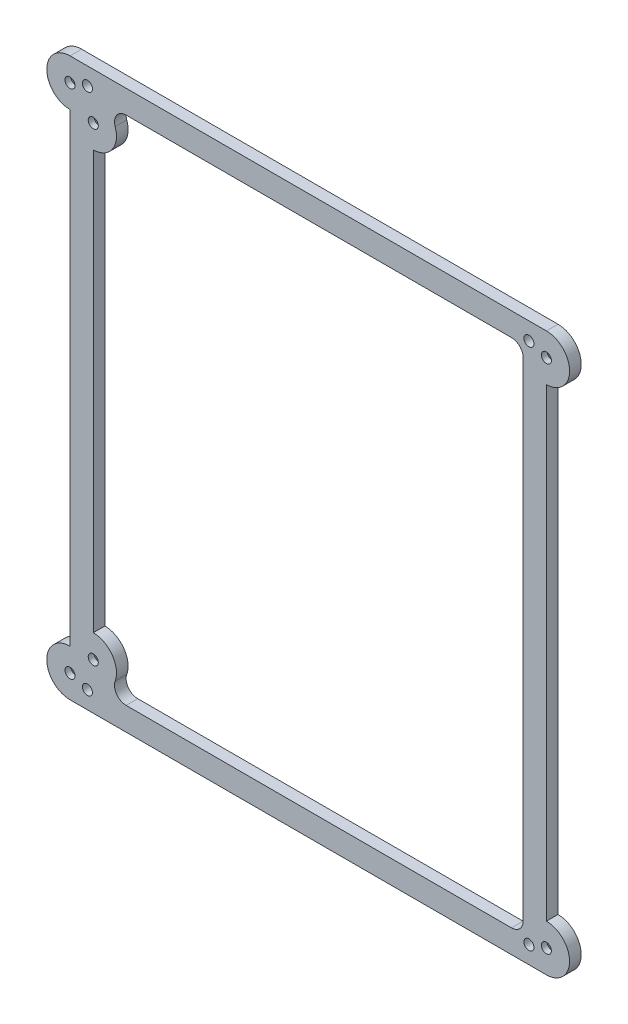
ISO-10303-21;
HEADER;
FILE_DESCRIPTION(('STEP AP214'),'2;1');
FILE_NAME('part.step','',(''),(''),'','','');
FILE_SCHEMA(('AUTOMOTIVE_DESIGN { 1 0 10303 214 1 1 1 1 }'));
ENDSEC;
DATA;
#1=APPLICATION_CONTEXT('core data for automotive mechanical design processes');
#2=APPLICATION_PROTOCOL_DEFINITION('international standard','automotive_design',2000,#1);
#3=PRODUCT_CONTEXT('',#1,'mechanical');
#4=PRODUCT('Part','Part','',(#3));
#5=PRODUCT_RELATED_PRODUCT_CATEGORY('part','',(#4));
#6=PRODUCT_DEFINITION_FORMATION('','',#4);
#7=PRODUCT_DEFINITION_CONTEXT('part definition',#1,'design');
#8=PRODUCT_DEFINITION('design','',#6,#7);
#9=PRODUCT_DEFINITION_SHAPE('','',#8);
#10=(LENGTH_UNIT() NAMED_UNIT(*) SI_UNIT(.MILLI.,.METRE.));
#11=(NAMED_UNIT(*) PLANE_ANGLE_UNIT() SI_UNIT($,.RADIAN.));
#12=(NAMED_UNIT(*) SI_UNIT($,.STERADIAN.) SOLID_ANGLE_UNIT());
#13=UNCERTAINTY_MEASURE_WITH_UNIT(LENGTH_MEASURE(1.E-05),#10,'distance_accuracy_value','');
#14=(GEOMETRIC_REPRESENTATION_CONTEXT(3) GLOBAL_UNCERTAINTY_ASSIGNED_CONTEXT((#13)) GLOBAL_UNIT_ASSIGNED_CONTEXT((#10,
#11,#12)) REPRESENTATION_CONTEXT('',''));
#15=CARTESIAN_POINT('',(0.,0.,0.));
#16=DIRECTION('',(0.,0.,1.));
#17=DIRECTION('',(1.,0.,0.));
#18=AXIS2_PLACEMENT_3D('',#15,#16,#17);
#19=CARTESIAN_POINT('',(-19.050000000002,6.35000000000164,6.35));
#20=DIRECTION('',(0.,0.,-1.));
#21=DIRECTION('',(-1.,0.,0.));
#22=AXIS2_PLACEMENT_3D('',#19,#20,#21);
#23=CYLINDRICAL_SURFACE('',#22,12.7);
#24=CARTESIAN_POINT('',(-19.050000000002,6.35000000000164,0.));
#25=DIRECTION('',(0.,0.,1.));
#26=DIRECTION('',(1.,0.,0.));
#27=AXIS2_PLACEMENT_3D('',#24,#25,#26);
#28=CIRCLE('',#27,12.7);
#29=CARTESIAN_POINT('',(-19.050000000002,19.0500000000016,0.));
#30=VERTEX_POINT('',#29);
#31=CARTESIAN_POINT('',(-19.050000000002,-6.34999999999836,0.));
#32=VERTEX_POINT('',#31);
#33=EDGE_CURVE('E272',#30,#32,#28,.T.);
#34=ORIENTED_EDGE('',*,*,#33,.T.);
#35=DIRECTION('',(0.,0.,-1.));
#36=VECTOR('',#35,1.);
#37=CARTESIAN_POINT('',(-19.050000000002,-6.34999999999836,6.35));
#38=LINE('',#37,#36);
#39=CARTESIAN_POINT('',(-19.050000000002,-6.34999999999836,6.35));
#40=VERTEX_POINT('',#39);
#41=EDGE_CURVE('E320',#40,#32,#38,.T.);
#42=ORIENTED_EDGE('',*,*,#41,.F.);
#43=CARTESIAN_POINT('',(-19.050000000002,6.35000000000164,6.35));
#44=DIRECTION('',(0.,0.,1.));
#45=DIRECTION('',(1.,0.,0.));
#46=AXIS2_PLACEMENT_3D('',#43,#44,#45);
#47=CIRCLE('',#46,12.7);
#48=CARTESIAN_POINT('',(-19.050000000002,19.0500000000016,6.35));
#49=VERTEX_POINT('',#48);
#50=EDGE_CURVE('E214',#49,#40,#47,.T.);
#51=ORIENTED_EDGE('',*,*,#50,.F.);
#52=DIRECTION('',(0.,0.,-1.));
#53=VECTOR('',#52,1.);
#54=CARTESIAN_POINT('',(-19.050000000002,19.0500000000016,6.35));
#55=LINE('',#54,#53);
#56=EDGE_CURVE('E182',#49,#30,#55,.T.);
#57=ORIENTED_EDGE('',*,*,#56,.T.);
#58=EDGE_LOOP('',(#34,#42,#51,#57));
#59=FACE_BOUND('',#58,.T.);
#60=ADVANCED_FACE('F43',(#59),#23,.T.);
#61=CARTESIAN_POINT('',(-19.050000000002,0.,6.35));
#62=DIRECTION('',(-1.,0.,0.));
#63=DIRECTION('',(0.,0.,1.));
#64=AXIS2_PLACEMENT_3D('',#61,#62,#63);
#65=PLANE('',#64);
#66=DIRECTION('',(0.,1.,0.));
#67=VECTOR('',#66,1.);
#68=CARTESIAN_POINT('',(-19.050000000002,0.,0.));
#69=LINE('',#68,#67);
#70=CARTESIAN_POINT('',(-19.050000000002,-260.35,0.));
#71=VERTEX_POINT('',#70);
#72=EDGE_CURVE('E275',#71,#32,#69,.T.);
#73=ORIENTED_EDGE('',*,*,#72,.F.);
#74=DIRECTION('',(0.,0.,-1.));
#75=VECTOR('',#74,1.);
#76=CARTESIAN_POINT('',(-19.050000000002,-260.35,6.35));
#77=LINE('',#76,#75);
#78=CARTESIAN_POINT('',(-19.050000000002,-260.35,6.35));
#79=VERTEX_POINT('',#78);
#80=EDGE_CURVE('E318',#79,#71,#77,.T.);
#81=ORIENTED_EDGE('',*,*,#80,.F.);
#82=DIRECTION('',(0.,1.,0.));
#83=VECTOR('',#82,1.);
#84=CARTESIAN_POINT('',(-19.050000000002,0.,6.35));
#85=LINE('',#84,#83);
#86=EDGE_CURVE('E216',#79,#40,#85,.T.);
#87=ORIENTED_EDGE('',*,*,#86,.T.);
#88=ORIENTED_EDGE('',*,*,#41,.T.);
#89=EDGE_LOOP('',(#73,#81,#87,#88));
#90=FACE_BOUND('',#89,.T.);
#91=ADVANCED_FACE('F436',(#90),#65,.T.);
#92=CARTESIAN_POINT('',(-19.050000000002,-273.05,6.35));
#93=DIRECTION('',(0.,0.,-1.));
#94=DIRECTION('',(-1.,0.,0.));
#95=AXIS2_PLACEMENT_3D('',#92,#93,#94);
#96=CYLINDRICAL_SURFACE('',#95,12.7);
#97=CARTESIAN_POINT('',(-19.050000000002,-273.05,0.));
#98=DIRECTION('',(0.,0.,1.));
#99=DIRECTION('',(1.,0.,0.));
#100=AXIS2_PLACEMENT_3D('',#97,#98,#99);
#101=CIRCLE('',#100,12.7);
#102=CARTESIAN_POINT('',(-19.050000000002,-285.75,0.));
#103=VERTEX_POINT('',#102);
#104=EDGE_CURVE('E278',#103,#71,#101,.F.);
#105=ORIENTED_EDGE('',*,*,#104,.F.);
#106=DIRECTION('',(0.,0.,-1.));
#107=VECTOR('',#106,1.);
#108=CARTESIAN_POINT('',(-19.050000000002,-285.75,6.35));
#109=LINE('',#108,#107);
#110=CARTESIAN_POINT('',(-19.050000000002,-285.75,6.35));
#111=VERTEX_POINT('',#110);
#112=EDGE_CURVE('E316',#111,#103,#109,.T.);
#113=ORIENTED_EDGE('',*,*,#112,.F.);
#114=CARTESIAN_POINT('',(-19.050000000002,-273.05,6.35));
#115=DIRECTION('',(0.,0.,1.));
#116=DIRECTION('',(1.,0.,0.));
#117=AXIS2_PLACEMENT_3D('',#114,#115,#116);
#118=CIRCLE('',#117,12.7);
#119=EDGE_CURVE('E219',#111,#79,#118,.F.);
#120=ORIENTED_EDGE('',*,*,#119,.T.);
#121=ORIENTED_EDGE('',*,*,#80,.T.);
#122=EDGE_LOOP('',(#105,#113,#120,#121));
#123=FACE_BOUND('',#122,.T.);
#124=ADVANCED_FACE('F442',(#123),#96,.T.);
#125=CARTESIAN_POINT('',(0.,-285.75,6.35));
#126=DIRECTION('',(0.,1.,0.));
#127=DIRECTION('',(0.,0.,1.));
#128=AXIS2_PLACEMENT_3D('',#125,#126,#127);
#129=PLANE('',#128);
#130=DIRECTION('',(1.,0.,0.));
#131=VECTOR('',#130,1.);
#132=CARTESIAN_POINT('',(0.,-285.75,0.));
#133=LINE('',#132,#131);
#134=CARTESIAN_POINT('',(241.3,-285.75,0.));
#135=VERTEX_POINT('',#134);
#136=EDGE_CURVE('E281',#103,#135,#133,.T.);
#137=ORIENTED_EDGE('',*,*,#136,.T.);
#138=DIRECTION('',(0.,0.,-1.));
#139=VECTOR('',#138,1.);
#140=CARTESIAN_POINT('',(241.3,-285.75,6.35));
#141=LINE('',#140,#139);
#142=CARTESIAN_POINT('',(241.3,-285.75,6.35));
#143=VERTEX_POINT('',#142);
#144=EDGE_CURVE('E314',#143,#135,#141,.T.);
#145=ORIENTED_EDGE('',*,*,#144,.F.);
#146=DIRECTION('',(1.,0.,0.));
#147=VECTOR('',#146,1.);
#148=CARTESIAN_POINT('',(0.,-285.75,6.35));
#149=LINE('',#148,#147);
#150=EDGE_CURVE('E222',#111,#143,#149,.T.);
#151=ORIENTED_EDGE('',*,*,#150,.F.);
#152=ORIENTED_EDGE('',*,*,#112,.T.);
#153=EDGE_LOOP('',(#137,#145,#151,#152));
#154=FACE_BOUND('',#153,.T.);
#155=ADVANCED_FACE('F578',(#154),#129,.F.);
#156=CARTESIAN_POINT('',(241.3,-273.05,6.35));
#157=DIRECTION('',(0.,0.,-1.));
#158=DIRECTION('',(-1.,0.,0.));
#159=AXIS2_PLACEMENT_3D('',#156,#157,#158);
#160=CYLINDRICAL_SURFACE('',#159,12.7);
#161=CARTESIAN_POINT('',(241.3,-273.05,0.));
#162=DIRECTION('',(0.,0.,1.));
#163=DIRECTION('',(1.,0.,0.));
#164=AXIS2_PLACEMENT_3D('',#161,#162,#163);
#165=CIRCLE('',#164,12.7);
#166=CARTESIAN_POINT('',(241.3,-260.35,0.));
#167=VERTEX_POINT('',#166);
#168=EDGE_CURVE('E284',#167,#135,#165,.F.);
#169=ORIENTED_EDGE('',*,*,#168,.F.);
#170=DIRECTION('',(0.,0.,-1.));
#171=VECTOR('',#170,1.);
#172=CARTESIAN_POINT('',(241.3,-260.35,6.35));
#173=LINE('',#172,#171);
#174=CARTESIAN_POINT('',(241.3,-260.35,6.35));
#175=VERTEX_POINT('',#174);
#176=EDGE_CURVE('E312',#175,#167,#173,.T.);
#177=ORIENTED_EDGE('',*,*,#176,.F.);
#178=CARTESIAN_POINT('',(241.3,-273.05,6.35));
#179=DIRECTION('',(0.,0.,1.));
#180=DIRECTION('',(1.,0.,0.));
#181=AXIS2_PLACEMENT_3D('',#178,#179,#180);
#182=CIRCLE('',#181,12.7);
#183=EDGE_CURVE('E224',#175,#143,#182,.F.);
#184=ORIENTED_EDGE('',*,*,#183,.T.);
#185=ORIENTED_EDGE('',*,*,#144,.T.);
#186=EDGE_LOOP('',(#169,#177,#184,#185));
#187=FACE_BOUND('',#186,.T.);
#188=ADVANCED_FACE('F574',(#187),#160,.T.);
#189=CARTESIAN_POINT('',(241.3,0.,6.35));
#190=DIRECTION('',(-1.,0.,0.));
#191=DIRECTION('',(0.,0.,1.));
#192=AXIS2_PLACEMENT_3D('',#189,#190,#191);
#193=PLANE('',#192);
#194=DIRECTION('',(0.,1.,0.));
#195=VECTOR('',#194,1.);
#196=CARTESIAN_POINT('',(241.3,0.,0.));
#197=LINE('',#196,#195);
#198=CARTESIAN_POINT('',(241.3,-6.34999999999845,0.));
#199=VERTEX_POINT('',#198);
#200=EDGE_CURVE('E287',#167,#199,#197,.T.);
#201=ORIENTED_EDGE('',*,*,#200,.T.);
#202=DIRECTION('',(0.,0.,-1.));
#203=VECTOR('',#202,1.);
#204=CARTESIAN_POINT('',(241.3,-6.34999999999845,6.35));
#205=LINE('',#204,#203);
#206=CARTESIAN_POINT('',(241.3,-6.34999999999845,6.35));
#207=VERTEX_POINT('',#206);
#208=EDGE_CURVE('E310',#207,#199,#205,.T.);
#209=ORIENTED_EDGE('',*,*,#208,.F.);
#210=DIRECTION('',(0.,1.,0.));
#211=VECTOR('',#210,1.);
#212=CARTESIAN_POINT('',(241.3,0.,6.35));
#213=LINE('',#212,#211);
#214=EDGE_CURVE('E227',#175,#207,#213,.T.);
#215=ORIENTED_EDGE('',*,*,#214,.F.);
#216=ORIENTED_EDGE('',*,*,#176,.T.);
#217=EDGE_LOOP('',(#201,#209,#215,#216));
#218=FACE_BOUND('',#217,.T.);
#219=ADVANCED_FACE('F570',(#218),#193,.F.);
#220=CARTESIAN_POINT('',(241.3,6.3500000000016,6.35));
#221=DIRECTION('',(0.,0.,-1.));
#222=DIRECTION('',(-1.,0.,0.));
#223=AXIS2_PLACEMENT_3D('',#220,#221,#222);
#224=CYLINDRICAL_SURFACE('',#223,12.7000000000001);
#225=CARTESIAN_POINT('',(241.3,6.3500000000016,0.));
#226=DIRECTION('',(0.,0.,1.));
#227=DIRECTION('',(1.,0.,0.));
#228=AXIS2_PLACEMENT_3D('',#225,#226,#227);
#229=CIRCLE('',#228,12.7000000000001);
#230=CARTESIAN_POINT('',(241.3,19.0500000000016,0.));
#231=VERTEX_POINT('',#230);
#232=EDGE_CURVE('E290',#231,#199,#229,.F.);
#233=ORIENTED_EDGE('',*,*,#232,.F.);
#234=DIRECTION('',(0.,0.,-1.));
#235=VECTOR('',#234,1.);
#236=CARTESIAN_POINT('',(241.3,19.0500000000016,6.35));
#237=LINE('',#236,#235);
#238=CARTESIAN_POINT('',(241.3,19.0500000000016,6.35));
#239=VERTEX_POINT('',#238);
#240=EDGE_CURVE('E308',#239,#231,#237,.T.);
#241=ORIENTED_EDGE('',*,*,#240,.F.);
#242=CARTESIAN_POINT('',(241.3,6.3500000000016,6.35));
#243=DIRECTION('',(0.,0.,1.));
#244=DIRECTION('',(1.,0.,0.));
#245=AXIS2_PLACEMENT_3D('',#242,#243,#244);
#246=CIRCLE('',#245,12.7000000000001);
#247=EDGE_CURVE('E229',#239,#207,#246,.F.);
#248=ORIENTED_EDGE('',*,*,#247,.T.);
#249=ORIENTED_EDGE('',*,*,#208,.T.);
#250=EDGE_LOOP('',(#233,#241,#248,#249));
#251=FACE_BOUND('',#250,.T.);
#252=ADVANCED_FACE('F469',(#251),#224,.T.);
#253=CARTESIAN_POINT('',(-6.35000000000197,0.,6.35));
#254=DIRECTION('',(1.,0.,0.));
#255=DIRECTION('',(0.,0.,-1.));
#256=AXIS2_PLACEMENT_3D('',#253,#254,#255);
#257=PLANE('',#256);
#258=DIRECTION('',(0.,-1.,0.));
#259=VECTOR('',#258,1.);
#260=CARTESIAN_POINT('',(-6.35000000000197,0.,0.));
#261=LINE('',#260,#259);
#262=CARTESIAN_POINT('',(-6.35000000000197,-19.0499999999984,0.));
#263=VERTEX_POINT('',#262);
#264=CARTESIAN_POINT('',(-6.35000000000197,-247.65,0.));
#265=VERTEX_POINT('',#264);
#266=EDGE_CURVE('E178',#263,#265,#261,.T.);
#267=ORIENTED_EDGE('',*,*,#266,.F.);
#268=DIRECTION('',(0.,0.,-1.));
#269=VECTOR('',#268,1.);
#270=CARTESIAN_POINT('',(-6.35000000000197,-19.0499999999984,6.35));
#271=LINE('',#270,#269);
#272=CARTESIAN_POINT('',(-6.35000000000197,-19.0499999999984,6.35));
#273=VERTEX_POINT('',#272);
#274=EDGE_CURVE('E171',#273,#263,#271,.T.);
#275=ORIENTED_EDGE('',*,*,#274,.F.);
#276=DIRECTION('',(0.,-1.,0.));
#277=VECTOR('',#276,1.);
#278=CARTESIAN_POINT('',(-6.35000000000197,0.,6.35));
#279=LINE('',#278,#277);
#280=CARTESIAN_POINT('',(-6.35000000000197,-247.65,6.35));
#281=VERTEX_POINT('',#280);
#282=EDGE_CURVE('E176',#273,#281,#279,.T.);
#283=ORIENTED_EDGE('',*,*,#282,.T.);
#284=DIRECTION('',(0.,0.,-1.));
#285=VECTOR('',#284,1.);
#286=CARTESIAN_POINT('',(-6.35000000000197,-247.65,6.35));
#287=LINE('',#286,#285);
#288=EDGE_CURVE('E183',#281,#265,#287,.T.);
#289=ORIENTED_EDGE('',*,*,#288,.T.);
#290=EDGE_LOOP('',(#267,#275,#283,#289));
#291=FACE_BOUND('',#290,.T.);
#292=ADVANCED_FACE('F173',(#291),#257,.T.);
#293=CARTESIAN_POINT('',(-6.35000000000197,-6.34999999999836,6.35));
#294=DIRECTION('',(0.,0.,-1.));
#295=DIRECTION('',(-1.,0.,0.));
#296=AXIS2_PLACEMENT_3D('',#293,#294,#295);
#297=CYLINDRICAL_SURFACE('',#296,12.7);
#298=CARTESIAN_POINT('',(-6.35000000000197,-6.34999999999836,0.));
#299=DIRECTION('',(0.,0.,1.));
#300=DIRECTION('',(1.,0.,0.));
#301=AXIS2_PLACEMENT_3D('',#298,#299,#300);
#302=CIRCLE('',#301,12.7);
#303=CARTESIAN_POINT('',(5.62367482809024,-2.11666666666502,0.));
#304=VERTEX_POINT('',#303);
#305=EDGE_CURVE('E260',#263,#304,#302,.T.);
#306=ORIENTED_EDGE('',*,*,#305,.T.);
#307=DIRECTION('',(0.,0.,-1.));
#308=VECTOR('',#307,1.);
#309=CARTESIAN_POINT('',(5.62367482809024,-2.11666666666502,6.35));
#310=LINE('',#309,#308);
#311=CARTESIAN_POINT('',(5.62367482809024,-2.11666666666502,6.35));
#312=VERTEX_POINT('',#311);
#313=EDGE_CURVE('E189',#304,#312,#310,.F.);
#314=ORIENTED_EDGE('',*,*,#313,.T.);
#315=CARTESIAN_POINT('',(-6.35000000000197,-6.34999999999836,6.35));
#316=DIRECTION('',(0.,0.,1.));
#317=DIRECTION('',(1.,0.,0.));
#318=AXIS2_PLACEMENT_3D('',#315,#316,#317);
#319=CIRCLE('',#318,12.7);
#320=EDGE_CURVE('E186',#273,#312,#319,.T.);
#321=ORIENTED_EDGE('',*,*,#320,.F.);
#322=ORIENTED_EDGE('',*,*,#274,.T.);
#323=EDGE_LOOP('',(#306,#314,#321,#322));
#324=FACE_BOUND('',#323,.T.);
#325=ADVANCED_FACE('F187',(#324),#297,.T.);
#326=CARTESIAN_POINT('',(0.,6.35000000000165,6.35));
#327=DIRECTION('',(0.,1.,0.));
#328=DIRECTION('',(0.,0.,1.));
#329=AXIS2_PLACEMENT_3D('',#326,#327,#328);
#330=PLANE('',#329);
#331=DIRECTION('',(1.,0.,0.));
#332=VECTOR('',#331,1.);
#333=CARTESIAN_POINT('',(0.,6.35000000000165,6.35));
#334=LINE('',#333,#332);
#335=CARTESIAN_POINT('',(11.6105122421363,6.35000000000165,6.35));
#336=VERTEX_POINT('',#335);
#337=CARTESIAN_POINT('',(222.25,6.35000000000165,6.35));
#338=VERTEX_POINT('',#337);
#339=EDGE_CURVE('E191',#336,#338,#334,.T.);
#340=ORIENTED_EDGE('',*,*,#339,.F.);
#341=DIRECTION('',(0.,0.,1.));
#342=VECTOR('',#341,1.);
#343=CARTESIAN_POINT('',(11.6105122421363,6.35000000000165,0.));
#344=LINE('',#343,#342);
#345=CARTESIAN_POINT('',(11.6105122421363,6.35000000000165,0.));
#346=VERTEX_POINT('',#345);
#347=EDGE_CURVE('E333',#336,#346,#344,.F.);
#348=ORIENTED_EDGE('',*,*,#347,.T.);
#349=DIRECTION('',(1.,0.,0.));
#350=VECTOR('',#349,1.);
#351=CARTESIAN_POINT('',(0.,6.35000000000165,0.));
#352=LINE('',#351,#350);
#353=CARTESIAN_POINT('',(222.25,6.35000000000165,0.));
#354=VERTEX_POINT('',#353);
#355=EDGE_CURVE('E262',#346,#354,#352,.T.);
#356=ORIENTED_EDGE('',*,*,#355,.T.);
#357=DIRECTION('',(0.,0.,-1.));
#358=VECTOR('',#357,1.);
#359=CARTESIAN_POINT('',(222.25,6.35000000000165,6.35));
#360=LINE('',#359,#358);
#361=EDGE_CURVE('E331',#354,#338,#360,.F.);
#362=ORIENTED_EDGE('',*,*,#361,.T.);
#363=EDGE_LOOP('',(#340,#348,#356,#362));
#364=FACE_BOUND('',#363,.T.);
#365=ADVANCED_FACE('F463',(#364),#330,.F.);
#366=CARTESIAN_POINT('',(228.6,0.,6.35));
#367=DIRECTION('',(1.,0.,0.));
#368=DIRECTION('',(0.,0.,-1.));
#369=AXIS2_PLACEMENT_3D('',#366,#367,#368);
#370=PLANE('',#369);
#371=DIRECTION('',(0.,-1.,0.));
#372=VECTOR('',#371,1.);
#373=CARTESIAN_POINT('',(228.6,0.,6.35));
#374=LINE('',#373,#372);
#375=CARTESIAN_POINT('',(228.6,1.64972202565394E-12,6.35));
#376=VERTEX_POINT('',#375);
#377=CARTESIAN_POINT('',(228.6,-266.7,6.35));
#378=VERTEX_POINT('',#377);
#379=EDGE_CURVE('E205',#376,#378,#374,.T.);
#380=ORIENTED_EDGE('',*,*,#379,.F.);
#381=DIRECTION('',(0.,0.,-1.));
#382=VECTOR('',#381,1.);
#383=CARTESIAN_POINT('',(228.6,1.64972202565394E-12,0.));
#384=LINE('',#383,#382);
#385=CARTESIAN_POINT('',(228.6,1.64972202565394E-12,0.));
#386=VERTEX_POINT('',#385);
#387=EDGE_CURVE('E338',#376,#386,#384,.T.);
#388=ORIENTED_EDGE('',*,*,#387,.T.);
#389=DIRECTION('',(0.,-1.,0.));
#390=VECTOR('',#389,1.);
#391=CARTESIAN_POINT('',(228.6,0.,0.));
#392=LINE('',#391,#390);
#393=CARTESIAN_POINT('',(228.6,-266.7,0.));
#394=VERTEX_POINT('',#393);
#395=EDGE_CURVE('E265',#386,#394,#392,.T.);
#396=ORIENTED_EDGE('',*,*,#395,.T.);
#397=DIRECTION('',(0.,0.,-1.));
#398=VECTOR('',#397,1.);
#399=CARTESIAN_POINT('',(228.6,-266.7,6.35));
#400=LINE('',#399,#398);
#401=EDGE_CURVE('E59',#394,#378,#400,.F.);
#402=ORIENTED_EDGE('',*,*,#401,.T.);
#403=EDGE_LOOP('',(#380,#388,#396,#402));
#404=FACE_BOUND('',#403,.T.);
#405=ADVANCED_FACE('F459',(#404),#370,.F.);
#406=CARTESIAN_POINT('',(0.,-273.05,6.35));
#407=DIRECTION('',(0.,1.,0.));
#408=DIRECTION('',(-1.,0.,0.));
#409=AXIS2_PLACEMENT_3D('',#406,#407,#408);
#410=PLANE('',#409);
#411=DIRECTION('',(1.,0.,0.));
#412=VECTOR('',#411,1.);
#413=CARTESIAN_POINT('',(0.,-273.05,0.));
#414=LINE('',#413,#412);
#415=CARTESIAN_POINT('',(11.6105122421364,-273.05,0.));
#416=VERTEX_POINT('',#415);
#417=CARTESIAN_POINT('',(222.25,-273.05,0.));
#418=VERTEX_POINT('',#417);
#419=EDGE_CURVE('E267',#416,#418,#414,.T.);
#420=ORIENTED_EDGE('',*,*,#419,.F.);
#421=DIRECTION('',(0.,0.,-1.));
#422=VECTOR('',#421,1.);
#423=CARTESIAN_POINT('',(11.6105122421364,-273.05,6.35));
#424=LINE('',#423,#422);
#425=CARTESIAN_POINT('',(11.6105122421364,-273.05,6.35));
#426=VERTEX_POINT('',#425);
#427=EDGE_CURVE('E329',#416,#426,#424,.F.);
#428=ORIENTED_EDGE('',*,*,#427,.T.);
#429=DIRECTION('',(1.,0.,0.));
#430=VECTOR('',#429,1.);
#431=CARTESIAN_POINT('',(0.,-273.05,6.35));
#432=LINE('',#431,#430);
#433=CARTESIAN_POINT('',(222.25,-273.05,6.35));
#434=VERTEX_POINT('',#433);
#435=EDGE_CURVE('E207',#426,#434,#432,.T.);
#436=ORIENTED_EDGE('',*,*,#435,.T.);
#437=DIRECTION('',(0.,0.,-1.));
#438=VECTOR('',#437,1.);
#439=CARTESIAN_POINT('',(222.25,-273.05,6.35));
#440=LINE('',#439,#438);
#441=EDGE_CURVE('E326',#434,#418,#440,.T.);
#442=ORIENTED_EDGE('',*,*,#441,.T.);
#443=EDGE_LOOP('',(#420,#428,#436,#442));
#444=FACE_BOUND('',#443,.T.);
#445=ADVANCED_FACE('F455',(#444),#410,.T.);
#446=CARTESIAN_POINT('',(231.775,-276.225,6.35));
#447=DIRECTION('',(0.,0.,-1.));
#448=DIRECTION('',(-1.,0.,0.));
#449=AXIS2_PLACEMENT_3D('',#446,#447,#448);
#450=CYLINDRICAL_SURFACE('',#449,2.75000000000001);
#451=CARTESIAN_POINT('',(231.775,-276.225,6.35));
#452=DIRECTION('',(0.,0.,1.));
#453=DIRECTION('',(1.,0.,0.));
#454=AXIS2_PLACEMENT_3D('',#451,#452,#453);
#455=CIRCLE('',#454,2.75000000000001);
#456=CARTESIAN_POINT('',(234.525,-276.225,6.35));
#457=VERTEX_POINT('',#456);
#458=EDGE_CURVE('E253',#457,#457,#455,.T.);
#459=ORIENTED_EDGE('',*,*,#458,.T.);
#460=EDGE_LOOP('',(#459));
#461=FACE_BOUND('',#460,.T.);
#462=CARTESIAN_POINT('',(231.775,-276.225,0.));
#463=DIRECTION('',(0.,0.,1.));
#464=DIRECTION('',(1.,0.,0.));
#465=AXIS2_PLACEMENT_3D('',#462,#463,#464);
#466=CIRCLE('',#465,2.75000000000001);
#467=CARTESIAN_POINT('',(234.525,-276.225,0.));
#468=VERTEX_POINT('',#467);
#469=EDGE_CURVE('E302',#468,#468,#466,.T.);
#470=ORIENTED_EDGE('',*,*,#469,.F.);
#471=EDGE_LOOP('',(#470));
#472=FACE_BOUND('',#471,.T.);
#473=ADVANCED_FACE('F458',(#461,#472),#450,.F.);
#474=CARTESIAN_POINT('',(231.775,9.52499999999997,6.35));
#475=DIRECTION('',(0.,0.,-1.));
#476=DIRECTION('',(-1.,0.,0.));
#477=AXIS2_PLACEMENT_3D('',#474,#475,#476);
#478=CYLINDRICAL_SURFACE('',#477,2.75000000000001);
#479=CARTESIAN_POINT('',(231.775,9.52499999999997,6.35));
#480=DIRECTION('',(0.,0.,1.));
#481=DIRECTION('',(1.,0.,0.));
#482=AXIS2_PLACEMENT_3D('',#479,#480,#481);
#483=CIRCLE('',#482,2.75000000000001);
#484=CARTESIAN_POINT('',(234.525,9.52499999999997,6.35));
#485=VERTEX_POINT('',#484);
#486=EDGE_CURVE('E250',#485,#485,#483,.T.);
#487=ORIENTED_EDGE('',*,*,#486,.T.);
#488=EDGE_LOOP('',(#487));
#489=FACE_BOUND('',#488,.T.);
#490=CARTESIAN_POINT('',(231.775,9.52499999999997,0.));
#491=DIRECTION('',(0.,0.,1.));
#492=DIRECTION('',(1.,0.,0.));
#493=AXIS2_PLACEMENT_3D('',#490,#491,#492);
#494=CIRCLE('',#493,2.75000000000001);
#495=CARTESIAN_POINT('',(234.525,9.52499999999997,0.));
#496=VERTEX_POINT('',#495);
#497=EDGE_CURVE('E299',#496,#496,#494,.T.);
#498=ORIENTED_EDGE('',*,*,#497,.F.);
#499=EDGE_LOOP('',(#498));
#500=FACE_BOUND('',#499,.T.);
#501=ADVANCED_FACE('F546',(#489,#500),#478,.F.);
#502=CARTESIAN_POINT('',(-9.525,9.525,6.35));
#503=DIRECTION('',(0.,0.,-1.));
#504=DIRECTION('',(-1.,0.,0.));
#505=AXIS2_PLACEMENT_3D('',#502,#503,#504);
#506=CYLINDRICAL_SURFACE('',#505,2.75);
#507=CARTESIAN_POINT('',(-9.525,9.525,6.35));
#508=DIRECTION('',(0.,0.,1.));
#509=DIRECTION('',(1.,0.,0.));
#510=AXIS2_PLACEMENT_3D('',#507,#508,#509);
#511=CIRCLE('',#510,2.75);
#512=CARTESIAN_POINT('',(-6.775,9.525,6.35));
#513=VERTEX_POINT('',#512);
#514=EDGE_CURVE('E247',#513,#513,#511,.T.);
#515=ORIENTED_EDGE('',*,*,#514,.T.);
#516=EDGE_LOOP('',(#515));
#517=FACE_BOUND('',#516,.T.);
#518=CARTESIAN_POINT('',(-9.525,9.525,0.));
#519=DIRECTION('',(0.,0.,1.));
#520=DIRECTION('',(1.,0.,0.));
#521=AXIS2_PLACEMENT_3D('',#518,#519,#520);
#522=CIRCLE('',#521,2.75);
#523=CARTESIAN_POINT('',(-6.775,9.525,0.));
#524=VERTEX_POINT('',#523);
#525=EDGE_CURVE('E296',#524,#524,#522,.T.);
#526=ORIENTED_EDGE('',*,*,#525,.F.);
#527=EDGE_LOOP('',(#526));
#528=FACE_BOUND('',#527,.T.);
#529=ADVANCED_FACE('F550',(#517,#528),#506,.F.);
#530=CARTESIAN_POINT('',(-19.050000000002,6.35000000000164,6.35));
#531=DIRECTION('',(0.,0.,-1.));
#532=DIRECTION('',(-1.,0.,0.));
#533=AXIS2_PLACEMENT_3D('',#530,#531,#532);
#534=CYLINDRICAL_SURFACE('',#533,2.75);
#535=CARTESIAN_POINT('',(-19.050000000002,6.35000000000164,3.175));
#536=DIRECTION('',(0.,0.,1.));
#537=DIRECTION('',(1.,0.,0.));
#538=AXIS2_PLACEMENT_3D('',#535,#536,#537);
#539=CIRCLE('',#538,2.75);
#540=CARTESIAN_POINT('',(-16.300000000002,6.35000000000164,3.175));
#541=VERTEX_POINT('',#540);
#542=EDGE_CURVE('E380',#541,#541,#539,.F.);
#543=ORIENTED_EDGE('',*,*,#542,.T.);
#544=EDGE_LOOP('',(#543));
#545=FACE_BOUND('',#544,.T.);
#546=CARTESIAN_POINT('',(-19.050000000002,6.35000000000164,6.35));
#547=DIRECTION('',(0.,0.,1.));
#548=DIRECTION('',(1.,0.,0.));
#549=AXIS2_PLACEMENT_3D('',#546,#547,#548);
#550=CIRCLE('',#549,2.75);
#551=CARTESIAN_POINT('',(-16.300000000002,6.35000000000164,6.35));
#552=VERTEX_POINT('',#551);
#553=EDGE_CURVE('E244',#552,#552,#550,.T.);
#554=ORIENTED_EDGE('',*,*,#553,.T.);
#555=EDGE_LOOP('',(#554));
#556=FACE_BOUND('',#555,.T.);
#557=ADVANCED_FACE('F556',(#545,#556),#534,.F.);
#558=CARTESIAN_POINT('',(-19.050000000002,-273.05,6.35));
#559=DIRECTION('',(0.,0.,-1.));
#560=DIRECTION('',(-1.,0.,0.));
#561=AXIS2_PLACEMENT_3D('',#558,#559,#560);
#562=CYLINDRICAL_SURFACE('',#561,2.75);
#563=CARTESIAN_POINT('',(-19.050000000002,-273.05,3.175));
#564=DIRECTION('',(0.,0.,1.));
#565=DIRECTION('',(1.,0.,0.));
#566=AXIS2_PLACEMENT_3D('',#563,#564,#565);
#567=CIRCLE('',#566,2.75);
#568=CARTESIAN_POINT('',(-16.300000000002,-273.05,3.175));
#569=VERTEX_POINT('',#568);
#570=EDGE_CURVE('E11',#569,#569,#567,.F.);
#571=ORIENTED_EDGE('',*,*,#570,.T.);
#572=EDGE_LOOP('',(#571));
#573=FACE_BOUND('',#572,.T.);
#574=CARTESIAN_POINT('',(-19.050000000002,-273.05,6.35));
#575=DIRECTION('',(0.,0.,1.));
#576=DIRECTION('',(1.,0.,0.));
#577=AXIS2_PLACEMENT_3D('',#574,#575,#576);
#578=CIRCLE('',#577,2.75);
#579=CARTESIAN_POINT('',(-16.300000000002,-273.05,6.35));
#580=VERTEX_POINT('',#579);
#581=EDGE_CURVE('E241',#580,#580,#578,.T.);
#582=ORIENTED_EDGE('',*,*,#581,.T.);
#583=EDGE_LOOP('',(#582));
#584=FACE_BOUND('',#583,.T.);
#585=ADVANCED_FACE('F527',(#573,#584),#562,.F.);
#586=CARTESIAN_POINT('',(241.3,6.3500000000016,6.35));
#587=DIRECTION('',(0.,0.,-1.));
#588=DIRECTION('',(-1.,0.,0.));
#589=AXIS2_PLACEMENT_3D('',#586,#587,#588);
#590=CYLINDRICAL_SURFACE('',#589,2.75000000000001);
#591=CARTESIAN_POINT('',(241.3,6.3500000000016,3.17500000000007));
#592=DIRECTION('',(0.,0.,1.));
#593=DIRECTION('',(1.,0.,0.));
#594=AXIS2_PLACEMENT_3D('',#591,#592,#593);
#595=CIRCLE('',#594,2.75000000000001);
#596=CARTESIAN_POINT('',(244.05,6.3500000000016,3.17500000000007));
#597=VERTEX_POINT('',#596);
#598=EDGE_CURVE('E383',#597,#597,#595,.F.);
#599=ORIENTED_EDGE('',*,*,#598,.T.);
#600=EDGE_LOOP('',(#599));
#601=FACE_BOUND('',#600,.T.);
#602=CARTESIAN_POINT('',(241.3,6.3500000000016,6.35));
#603=DIRECTION('',(0.,0.,1.));
#604=DIRECTION('',(1.,0.,0.));
#605=AXIS2_PLACEMENT_3D('',#602,#603,#604);
#606=CIRCLE('',#605,2.75000000000001);
#607=CARTESIAN_POINT('',(244.05,6.3500000000016,6.35));
#608=VERTEX_POINT('',#607);
#609=EDGE_CURVE('E238',#608,#608,#606,.T.);
#610=ORIENTED_EDGE('',*,*,#609,.T.);
#611=EDGE_LOOP('',(#610));
#612=FACE_BOUND('',#611,.T.);
#613=ADVANCED_FACE('F524',(#601,#612),#590,.F.);
#614=CARTESIAN_POINT('',(241.3,-273.05,6.35));
#615=DIRECTION('',(0.,0.,-1.));
#616=DIRECTION('',(-1.,0.,0.));
#617=AXIS2_PLACEMENT_3D('',#614,#615,#616);
#618=CYLINDRICAL_SURFACE('',#617,2.75000000000001);
#619=CARTESIAN_POINT('',(241.3,-273.05,3.17500000000007));
#620=DIRECTION('',(0.,0.,1.));
#621=DIRECTION('',(1.,0.,0.));
#622=AXIS2_PLACEMENT_3D('',#619,#620,#621);
#623=CIRCLE('',#622,2.75000000000001);
#624=CARTESIAN_POINT('',(244.05,-273.05,3.17500000000007));
#625=VERTEX_POINT('',#624);
#626=EDGE_CURVE('E52',#625,#625,#623,.F.);
#627=ORIENTED_EDGE('',*,*,#626,.T.);
#628=EDGE_LOOP('',(#627));
#629=FACE_BOUND('',#628,.T.);
#630=CARTESIAN_POINT('',(241.3,-273.05,6.35));
#631=DIRECTION('',(0.,0.,1.));
#632=DIRECTION('',(1.,0.,0.));
#633=AXIS2_PLACEMENT_3D('',#630,#631,#632);
#634=CIRCLE('',#633,2.75000000000001);
#635=CARTESIAN_POINT('',(244.05,-273.05,6.35));
#636=VERTEX_POINT('',#635);
#637=EDGE_CURVE('E235',#636,#636,#634,.T.);
#638=ORIENTED_EDGE('',*,*,#637,.T.);
#639=EDGE_LOOP('',(#638));
#640=FACE_BOUND('',#639,.T.);
#641=ADVANCED_FACE('F388',(#629,#640),#618,.F.);
#642=CARTESIAN_POINT('',(0.,19.0500000000016,6.35));
#643=DIRECTION('',(0.,1.,0.));
#644=DIRECTION('',(0.,0.,1.));
#645=AXIS2_PLACEMENT_3D('',#642,#643,#644);
#646=PLANE('',#645);
#647=DIRECTION('',(1.,0.,0.));
#648=VECTOR('',#647,1.);
#649=CARTESIAN_POINT('',(0.,19.0500000000016,0.));
#650=LINE('',#649,#648);
#651=EDGE_CURVE('E293',#30,#231,#650,.T.);
#652=ORIENTED_EDGE('',*,*,#651,.F.);
#653=ORIENTED_EDGE('',*,*,#56,.F.);
#654=DIRECTION('',(1.,0.,0.));
#655=VECTOR('',#654,1.);
#656=CARTESIAN_POINT('',(0.,19.0500000000016,6.35));
#657=LINE('',#656,#655);
#658=EDGE_CURVE('E232',#49,#239,#657,.T.);
#659=ORIENTED_EDGE('',*,*,#658,.T.);
#660=ORIENTED_EDGE('',*,*,#240,.T.);
#661=EDGE_LOOP('',(#652,#653,#659,#660));
#662=FACE_BOUND('',#661,.T.);
#663=ADVANCED_FACE('F450',(#662),#646,.T.);
#664=CARTESIAN_POINT('',(-6.35000000000198,-260.35,6.35));
#665=DIRECTION('',(0.,0.,-1.));
#666=DIRECTION('',(-1.,0.,0.));
#667=AXIS2_PLACEMENT_3D('',#664,#665,#666);
#668=CYLINDRICAL_SURFACE('',#667,2.75);
#669=CARTESIAN_POINT('',(-6.35000000000198,-260.35,3.175));
#670=DIRECTION('',(0.,0.,1.));
#671=DIRECTION('',(1.,0.,0.));
#672=AXIS2_PLACEMENT_3D('',#669,#670,#671);
#673=CIRCLE('',#672,2.75);
#674=CARTESIAN_POINT('',(-3.60000000000197,-260.35,3.175));
#675=VERTEX_POINT('',#674);
#676=EDGE_CURVE('E377',#675,#675,#673,.F.);
#677=ORIENTED_EDGE('',*,*,#676,.T.);
#678=EDGE_LOOP('',(#677));
#679=FACE_BOUND('',#678,.T.);
#680=CARTESIAN_POINT('',(-6.35000000000198,-260.35,6.35));
#681=DIRECTION('',(0.,0.,1.));
#682=DIRECTION('',(1.,0.,0.));
#683=AXIS2_PLACEMENT_3D('',#680,#681,#682);
#684=CIRCLE('',#683,2.75);
#685=CARTESIAN_POINT('',(-3.60000000000197,-260.35,6.35));
#686=VERTEX_POINT('',#685);
#687=EDGE_CURVE('E211',#686,#686,#684,.T.);
#688=ORIENTED_EDGE('',*,*,#687,.T.);
#689=EDGE_LOOP('',(#688));
#690=FACE_BOUND('',#689,.T.);
#691=ADVANCED_FACE('F447',(#679,#690),#668,.F.);
#692=CARTESIAN_POINT('',(-6.35000000000198,-260.35,6.35));
#693=DIRECTION('',(0.,0.,-1.));
#694=DIRECTION('',(-1.,0.,0.));
#695=AXIS2_PLACEMENT_3D('',#692,#693,#694);
#696=CYLINDRICAL_SURFACE('',#695,12.7);
#697=CARTESIAN_POINT('',(-6.35000000000198,-260.35,6.35));
#698=DIRECTION('',(0.,0.,1.));
#699=DIRECTION('',(1.,0.,0.));
#700=AXIS2_PLACEMENT_3D('',#697,#698,#699);
#701=CIRCLE('',#700,12.7);
#702=CARTESIAN_POINT('',(5.62367482809029,-264.583333333333,6.35));
#703=VERTEX_POINT('',#702);
#704=EDGE_CURVE('E196',#703,#281,#701,.T.);
#705=ORIENTED_EDGE('',*,*,#704,.F.);
#706=DIRECTION('',(0.,0.,-1.));
#707=VECTOR('',#706,1.);
#708=CARTESIAN_POINT('',(5.62367482809029,-264.583333333333,6.35));
#709=LINE('',#708,#707);
#710=CARTESIAN_POINT('',(5.62367482809029,-264.583333333333,0.));
#711=VERTEX_POINT('',#710);
#712=EDGE_CURVE('E322',#703,#711,#709,.T.);
#713=ORIENTED_EDGE('',*,*,#712,.T.);
#714=CARTESIAN_POINT('',(-6.35000000000198,-260.35,0.));
#715=DIRECTION('',(0.,0.,1.));
#716=DIRECTION('',(1.,0.,0.));
#717=AXIS2_PLACEMENT_3D('',#714,#715,#716);
#718=CIRCLE('',#717,12.7);
#719=EDGE_CURVE('E270',#711,#265,#718,.T.);
#720=ORIENTED_EDGE('',*,*,#719,.T.);
#721=ORIENTED_EDGE('',*,*,#288,.F.);
#722=EDGE_LOOP('',(#705,#713,#720,#721));
#723=FACE_BOUND('',#722,.T.);
#724=ADVANCED_FACE('F431',(#723),#696,.T.);
#725=CARTESIAN_POINT('',(-6.35000000000197,-6.34999999999836,6.35));
#726=DIRECTION('',(0.,0.,-1.));
#727=DIRECTION('',(-1.,0.,0.));
#728=AXIS2_PLACEMENT_3D('',#725,#726,#727);
#729=CYLINDRICAL_SURFACE('',#728,2.75);
#730=CARTESIAN_POINT('',(-6.35000000000197,-6.34999999999836,3.175));
#731=DIRECTION('',(0.,0.,1.));
#732=DIRECTION('',(1.,0.,0.));
#733=AXIS2_PLACEMENT_3D('',#730,#731,#732);
#734=CIRCLE('',#733,2.75);
#735=CARTESIAN_POINT('',(-3.60000000000197,-6.34999999999836,3.175));
#736=VERTEX_POINT('',#735);
#737=EDGE_CURVE('E374',#736,#736,#734,.F.);
#738=ORIENTED_EDGE('',*,*,#737,.T.);
#739=EDGE_LOOP('',(#738));
#740=FACE_BOUND('',#739,.T.);
#741=CARTESIAN_POINT('',(-6.35000000000197,-6.34999999999836,6.35));
#742=DIRECTION('',(0.,0.,1.));
#743=DIRECTION('',(1.,0.,0.));
#744=AXIS2_PLACEMENT_3D('',#741,#742,#743);
#745=CIRCLE('',#744,2.75);
#746=CARTESIAN_POINT('',(-3.60000000000197,-6.34999999999836,6.35));
#747=VERTEX_POINT('',#746);
#748=EDGE_CURVE('E198',#747,#747,#745,.T.);
#749=ORIENTED_EDGE('',*,*,#748,.T.);
#750=EDGE_LOOP('',(#749));
#751=FACE_BOUND('',#750,.T.);
#752=ADVANCED_FACE('F420',(#740,#751),#729,.F.);
#753=CARTESIAN_POINT('',(-9.525,-276.225,6.35));
#754=DIRECTION('',(0.,0.,-1.));
#755=DIRECTION('',(-1.,0.,0.));
#756=AXIS2_PLACEMENT_3D('',#753,#754,#755);
#757=CYLINDRICAL_SURFACE('',#756,2.75);
#758=CARTESIAN_POINT('',(-9.525,-276.225,6.35));
#759=DIRECTION('',(0.,0.,1.));
#760=DIRECTION('',(1.,0.,0.));
#761=AXIS2_PLACEMENT_3D('',#758,#759,#760);
#762=CIRCLE('',#761,2.75);
#763=CARTESIAN_POINT('',(-6.77499999999999,-276.225,6.35));
#764=VERTEX_POINT('',#763);
#765=EDGE_CURVE('E256',#764,#764,#762,.T.);
#766=ORIENTED_EDGE('',*,*,#765,.T.);
#767=EDGE_LOOP('',(#766));
#768=FACE_BOUND('',#767,.T.);
#769=CARTESIAN_POINT('',(-9.525,-276.225,0.));
#770=DIRECTION('',(0.,0.,1.));
#771=DIRECTION('',(1.,0.,0.));
#772=AXIS2_PLACEMENT_3D('',#769,#770,#771);
#773=CIRCLE('',#772,2.75);
#774=CARTESIAN_POINT('',(-6.77499999999999,-276.225,0.));
#775=VERTEX_POINT('',#774);
#776=EDGE_CURVE('E201',#775,#775,#773,.T.);
#777=ORIENTED_EDGE('',*,*,#776,.F.);
#778=EDGE_LOOP('',(#777));
#779=FACE_BOUND('',#778,.T.);
#780=ADVANCED_FACE('F418',(#768,#779),#757,.F.);
#781=CARTESIAN_POINT('',(0.,0.,6.35));
#782=DIRECTION('',(0.,0.,1.));
#783=DIRECTION('',(1.,0.,0.));
#784=AXIS2_PLACEMENT_3D('',#781,#782,#783);
#785=PLANE('',#784);
#786=ORIENTED_EDGE('',*,*,#748,.F.);
#787=EDGE_LOOP('',(#786));
#788=FACE_BOUND('',#787,.T.);
#789=ORIENTED_EDGE('',*,*,#282,.F.);
#790=ORIENTED_EDGE('',*,*,#320,.T.);
#791=CARTESIAN_POINT('',(11.6105122421363,1.64972202565394E-12,6.35));
#792=DIRECTION('',(0.,0.,1.));
#793=DIRECTION('',(1.,0.,0.));
#794=AXIS2_PLACEMENT_3D('',#791,#792,#793);
#795=CIRCLE('',#794,6.35);
#796=EDGE_CURVE('E347',#312,#336,#795,.F.);
#797=ORIENTED_EDGE('',*,*,#796,.T.);
#798=ORIENTED_EDGE('',*,*,#339,.T.);
#799=CARTESIAN_POINT('',(222.25,1.64972202565394E-12,6.35));
#800=DIRECTION('',(0.,0.,1.));
#801=DIRECTION('',(1.,0.,0.));
#802=AXIS2_PLACEMENT_3D('',#799,#800,#801);
#803=CIRCLE('',#802,6.35);
#804=EDGE_CURVE('E66',#338,#376,#803,.F.);
#805=ORIENTED_EDGE('',*,*,#804,.T.);
#806=ORIENTED_EDGE('',*,*,#379,.T.);
#807=CARTESIAN_POINT('',(222.25,-266.7,6.35));
#808=DIRECTION('',(0.,0.,1.));
#809=DIRECTION('',(1.,0.,0.));
#810=AXIS2_PLACEMENT_3D('',#807,#808,#809);
#811=CIRCLE('',#810,6.35);
#812=EDGE_CURVE('E354',#378,#434,#811,.F.);
#813=ORIENTED_EDGE('',*,*,#812,.T.);
#814=ORIENTED_EDGE('',*,*,#435,.F.);
#815=CARTESIAN_POINT('',(11.6105122421364,-266.7,6.35));
#816=DIRECTION('',(0.,0.,1.));
#817=DIRECTION('',(1.,0.,0.));
#818=AXIS2_PLACEMENT_3D('',#815,#816,#817);
#819=CIRCLE('',#818,6.35);
#820=EDGE_CURVE('E343',#426,#703,#819,.F.);
#821=ORIENTED_EDGE('',*,*,#820,.T.);
#822=ORIENTED_EDGE('',*,*,#704,.T.);
#823=EDGE_LOOP('',(#789,#790,#797,#798,#805,#806,#813,#814,#821,#822));
#824=FACE_BOUND('',#823,.T.);
#825=ORIENTED_EDGE('',*,*,#687,.F.);
#826=EDGE_LOOP('',(#825));
#827=FACE_BOUND('',#826,.T.);
#828=ORIENTED_EDGE('',*,*,#50,.T.);
#829=ORIENTED_EDGE('',*,*,#86,.F.);
#830=ORIENTED_EDGE('',*,*,#119,.F.);
#831=ORIENTED_EDGE('',*,*,#150,.T.);
#832=ORIENTED_EDGE('',*,*,#183,.F.);
#833=ORIENTED_EDGE('',*,*,#214,.T.);
#834=ORIENTED_EDGE('',*,*,#247,.F.);
#835=ORIENTED_EDGE('',*,*,#658,.F.);
#836=EDGE_LOOP('',(#828,#829,#830,#831,#832,#833,#834,#835));
#837=FACE_BOUND('',#836,.T.);
#838=ORIENTED_EDGE('',*,*,#637,.F.);
#839=EDGE_LOOP('',(#838));
#840=FACE_BOUND('',#839,.T.);
#841=ORIENTED_EDGE('',*,*,#609,.F.);
#842=EDGE_LOOP('',(#841));
#843=FACE_BOUND('',#842,.T.);
#844=ORIENTED_EDGE('',*,*,#581,.F.);
#845=EDGE_LOOP('',(#844));
#846=FACE_BOUND('',#845,.T.);
#847=ORIENTED_EDGE('',*,*,#553,.F.);
#848=EDGE_LOOP('',(#847));
#849=FACE_BOUND('',#848,.T.);
#850=ORIENTED_EDGE('',*,*,#514,.F.);
#851=EDGE_LOOP('',(#850));
#852=FACE_BOUND('',#851,.T.);
#853=ORIENTED_EDGE('',*,*,#486,.F.);
#854=EDGE_LOOP('',(#853));
#855=FACE_BOUND('',#854,.T.);
#856=ORIENTED_EDGE('',*,*,#458,.F.);
#857=EDGE_LOOP('',(#856));
#858=FACE_BOUND('',#857,.T.);
#859=ORIENTED_EDGE('',*,*,#765,.F.);
#860=EDGE_LOOP('',(#859));
#861=FACE_BOUND('',#860,.T.);
#862=ADVANCED_FACE('F193',(#788,#824,#827,#837,#840,#843,#846,#849,#852,#855,#858,#861),#785,.T.);
#863=CARTESIAN_POINT('',(0.,0.,0.));
#864=DIRECTION('',(0.,0.,1.));
#865=DIRECTION('',(1.,0.,0.));
#866=AXIS2_PLACEMENT_3D('',#863,#864,#865);
#867=PLANE('',#866);
#868=CARTESIAN_POINT('',(-6.35000000000197,-6.34999999999836,0.));
#869=DIRECTION('',(0.,0.,1.));
#870=DIRECTION('',(1.,0.,0.));
#871=AXIS2_PLACEMENT_3D('',#868,#869,#870);
#872=CIRCLE('',#871,5.92499999999996);
#873=CARTESIAN_POINT('',(-0.425000000002016,-6.34999999999836,0.));
#874=VERTEX_POINT('',#873);
#875=EDGE_CURVE('E371',#874,#874,#872,.T.);
#876=ORIENTED_EDGE('',*,*,#875,.T.);
#877=EDGE_LOOP('',(#876));
#878=FACE_BOUND('',#877,.T.);
#879=CARTESIAN_POINT('',(-6.35000000000198,-260.35,0.));
#880=DIRECTION('',(0.,0.,1.));
#881=DIRECTION('',(1.,0.,0.));
#882=AXIS2_PLACEMENT_3D('',#879,#880,#881);
#883=CIRCLE('',#882,5.92500000000001);
#884=CARTESIAN_POINT('',(-0.425000000001962,-260.35,0.));
#885=VERTEX_POINT('',#884);
#886=EDGE_CURVE('E368',#885,#885,#883,.T.);
#887=ORIENTED_EDGE('',*,*,#886,.T.);
#888=EDGE_LOOP('',(#887));
#889=FACE_BOUND('',#888,.T.);
#890=CARTESIAN_POINT('',(-19.050000000002,6.35000000000164,0.));
#891=DIRECTION('',(0.,0.,1.));
#892=DIRECTION('',(1.,0.,0.));
#893=AXIS2_PLACEMENT_3D('',#890,#891,#892);
#894=CIRCLE('',#893,5.92499999999996);
#895=CARTESIAN_POINT('',(-13.125000000002,6.35000000000164,0.));
#896=VERTEX_POINT('',#895);
#897=EDGE_CURVE('E365',#896,#896,#894,.T.);
#898=ORIENTED_EDGE('',*,*,#897,.T.);
#899=EDGE_LOOP('',(#898));
#900=FACE_BOUND('',#899,.T.);
#901=CARTESIAN_POINT('',(241.3,6.3500000000016,0.));
#902=DIRECTION('',(0.,0.,1.));
#903=DIRECTION('',(1.,0.,0.));
#904=AXIS2_PLACEMENT_3D('',#901,#902,#903);
#905=CIRCLE('',#904,5.92500000000013);
#906=CARTESIAN_POINT('',(247.225,6.3500000000016,0.));
#907=VERTEX_POINT('',#906);
#908=EDGE_CURVE('E362',#907,#907,#905,.T.);
#909=ORIENTED_EDGE('',*,*,#908,.T.);
#910=EDGE_LOOP('',(#909));
#911=FACE_BOUND('',#910,.T.);
#912=CARTESIAN_POINT('',(241.3,-273.05,0.));
#913=DIRECTION('',(0.,0.,1.));
#914=DIRECTION('',(1.,0.,0.));
#915=AXIS2_PLACEMENT_3D('',#912,#913,#914);
#916=CIRCLE('',#915,5.92500000000013);
#917=CARTESIAN_POINT('',(247.225,-273.05,0.));
#918=VERTEX_POINT('',#917);
#919=EDGE_CURVE('E359',#918,#918,#916,.T.);
#920=ORIENTED_EDGE('',*,*,#919,.T.);
#921=EDGE_LOOP('',(#920));
#922=FACE_BOUND('',#921,.T.);
#923=CARTESIAN_POINT('',(-19.050000000002,-273.05,0.));
#924=DIRECTION('',(0.,0.,1.));
#925=DIRECTION('',(1.,0.,0.));
#926=AXIS2_PLACEMENT_3D('',#923,#924,#925);
#927=CIRCLE('',#926,5.92499999999996);
#928=CARTESIAN_POINT('',(-13.125000000002,-273.05,0.));
#929=VERTEX_POINT('',#928);
#930=EDGE_CURVE('E356',#929,#929,#927,.T.);
#931=ORIENTED_EDGE('',*,*,#930,.T.);
#932=EDGE_LOOP('',(#931));
#933=FACE_BOUND('',#932,.T.);
#934=ORIENTED_EDGE('',*,*,#266,.T.);
#935=ORIENTED_EDGE('',*,*,#719,.F.);
#936=CARTESIAN_POINT('',(11.6105122421364,-266.7,0.));
#937=DIRECTION('',(0.,0.,1.));
#938=DIRECTION('',(1.,0.,0.));
#939=AXIS2_PLACEMENT_3D('',#936,#937,#938);
#940=CIRCLE('',#939,6.35);
#941=EDGE_CURVE('E341',#711,#416,#940,.T.);
#942=ORIENTED_EDGE('',*,*,#941,.T.);
#943=ORIENTED_EDGE('',*,*,#419,.T.);
#944=CARTESIAN_POINT('',(222.25,-266.7,0.));
#945=DIRECTION('',(0.,0.,1.));
#946=DIRECTION('',(1.,0.,0.));
#947=AXIS2_PLACEMENT_3D('',#944,#945,#946);
#948=CIRCLE('',#947,6.35);
#949=EDGE_CURVE('E352',#418,#394,#948,.T.);
#950=ORIENTED_EDGE('',*,*,#949,.T.);
#951=ORIENTED_EDGE('',*,*,#395,.F.);
#952=CARTESIAN_POINT('',(222.25,1.64972202565394E-12,0.));
#953=DIRECTION('',(0.,0.,1.));
#954=DIRECTION('',(1.,0.,0.));
#955=AXIS2_PLACEMENT_3D('',#952,#953,#954);
#956=CIRCLE('',#955,6.35);
#957=EDGE_CURVE('E349',#386,#354,#956,.T.);
#958=ORIENTED_EDGE('',*,*,#957,.T.);
#959=ORIENTED_EDGE('',*,*,#355,.F.);
#960=CARTESIAN_POINT('',(11.6105122421363,1.64972202565394E-12,0.));
#961=DIRECTION('',(0.,0.,1.));
#962=DIRECTION('',(1.,0.,0.));
#963=AXIS2_PLACEMENT_3D('',#960,#961,#962);
#964=CIRCLE('',#963,6.35);
#965=EDGE_CURVE('E345',#346,#304,#964,.T.);
#966=ORIENTED_EDGE('',*,*,#965,.T.);
#967=ORIENTED_EDGE('',*,*,#305,.F.);
#968=EDGE_LOOP('',(#934,#935,#942,#943,#950,#951,#958,#959,#966,#967));
#969=FACE_BOUND('',#968,.T.);
#970=ORIENTED_EDGE('',*,*,#33,.F.);
#971=ORIENTED_EDGE('',*,*,#651,.T.);
#972=ORIENTED_EDGE('',*,*,#232,.T.);
#973=ORIENTED_EDGE('',*,*,#200,.F.);
#974=ORIENTED_EDGE('',*,*,#168,.T.);
#975=ORIENTED_EDGE('',*,*,#136,.F.);
#976=ORIENTED_EDGE('',*,*,#104,.T.);
#977=ORIENTED_EDGE('',*,*,#72,.T.);
#978=EDGE_LOOP('',(#970,#971,#972,#973,#974,#975,#976,#977));
#979=FACE_BOUND('',#978,.T.);
#980=ORIENTED_EDGE('',*,*,#525,.T.);
#981=EDGE_LOOP('',(#980));
#982=FACE_BOUND('',#981,.T.);
#983=ORIENTED_EDGE('',*,*,#497,.T.);
#984=EDGE_LOOP('',(#983));
#985=FACE_BOUND('',#984,.T.);
#986=ORIENTED_EDGE('',*,*,#469,.T.);
#987=EDGE_LOOP('',(#986));
#988=FACE_BOUND('',#987,.T.);
#989=ORIENTED_EDGE('',*,*,#776,.T.);
#990=EDGE_LOOP('',(#989));
#991=FACE_BOUND('',#990,.T.);
#992=ADVANCED_FACE('F397',(#878,#889,#900,#911,#922,#933,#969,#979,#982,#985,#988,#991),#867,.F.);
#993=CARTESIAN_POINT('',(11.6105122421364,-266.7,6.35));
#994=DIRECTION('',(0.,0.,-1.));
#995=DIRECTION('',(-1.,0.,0.));
#996=AXIS2_PLACEMENT_3D('',#993,#994,#995);
#997=CYLINDRICAL_SURFACE('',#996,6.35);
#998=ORIENTED_EDGE('',*,*,#820,.F.);
#999=ORIENTED_EDGE('',*,*,#427,.F.);
#1000=ORIENTED_EDGE('',*,*,#941,.F.);
#1001=ORIENTED_EDGE('',*,*,#712,.F.);
#1002=EDGE_LOOP('',(#998,#999,#1000,#1001));
#1003=FACE_BOUND('',#1002,.T.);
#1004=ADVANCED_FACE('F400',(#1003),#997,.F.);
#1005=CARTESIAN_POINT('',(11.6105122421363,1.64972202565394E-12,6.35));
#1006=DIRECTION('',(0.,0.,-1.));
#1007=DIRECTION('',(-1.,0.,0.));
#1008=AXIS2_PLACEMENT_3D('',#1005,#1006,#1007);
#1009=CYLINDRICAL_SURFACE('',#1008,6.35);
#1010=ORIENTED_EDGE('',*,*,#796,.F.);
#1011=ORIENTED_EDGE('',*,*,#313,.F.);
#1012=ORIENTED_EDGE('',*,*,#965,.F.);
#1013=ORIENTED_EDGE('',*,*,#347,.F.);
#1014=EDGE_LOOP('',(#1010,#1011,#1012,#1013));
#1015=FACE_BOUND('',#1014,.T.);
#1016=ADVANCED_FACE('F473',(#1015),#1009,.F.);
#1017=CARTESIAN_POINT('',(222.25,1.64972202565394E-12,6.35));
#1018=DIRECTION('',(0.,0.,1.));
#1019=DIRECTION('',(1.,0.,0.));
#1020=AXIS2_PLACEMENT_3D('',#1017,#1018,#1019);
#1021=CYLINDRICAL_SURFACE('',#1020,6.35);
#1022=ORIENTED_EDGE('',*,*,#804,.F.);
#1023=ORIENTED_EDGE('',*,*,#361,.F.);
#1024=ORIENTED_EDGE('',*,*,#957,.F.);
#1025=ORIENTED_EDGE('',*,*,#387,.F.);
#1026=EDGE_LOOP('',(#1022,#1023,#1024,#1025));
#1027=FACE_BOUND('',#1026,.T.);
#1028=ADVANCED_FACE('F477',(#1027),#1021,.F.);
#1029=CARTESIAN_POINT('',(222.25,-266.7,6.35));
#1030=DIRECTION('',(0.,0.,-1.));
#1031=DIRECTION('',(-1.,0.,0.));
#1032=AXIS2_PLACEMENT_3D('',#1029,#1030,#1031);
#1033=CYLINDRICAL_SURFACE('',#1032,6.35);
#1034=ORIENTED_EDGE('',*,*,#812,.F.);
#1035=ORIENTED_EDGE('',*,*,#401,.F.);
#1036=ORIENTED_EDGE('',*,*,#949,.F.);
#1037=ORIENTED_EDGE('',*,*,#441,.F.);
#1038=EDGE_LOOP('',(#1034,#1035,#1036,#1037));
#1039=FACE_BOUND('',#1038,.T.);
#1040=ADVANCED_FACE('F481',(#1039),#1033,.F.);
#1041=CARTESIAN_POINT('',(-6.35000000000197,-6.34999999999836,0.));
#1042=DIRECTION('',(0.,0.,-1.));
#1043=DIRECTION('',(-1.,0.,0.));
#1044=AXIS2_PLACEMENT_3D('',#1041,#1042,#1043);
#1045=CONICAL_SURFACE('',#1044,5.92499999999996,0.785398163397441);
#1046=ORIENTED_EDGE('',*,*,#737,.F.);
#1047=EDGE_LOOP('',(#1046));
#1048=FACE_BOUND('',#1047,.T.);
#1049=ORIENTED_EDGE('',*,*,#875,.F.);
#1050=EDGE_LOOP('',(#1049));
#1051=FACE_BOUND('',#1050,.T.);
#1052=ADVANCED_FACE('F485',(#1048,#1051),#1045,.F.);
#1053=CARTESIAN_POINT('',(-6.35000000000198,-260.35,0.));
#1054=DIRECTION('',(0.,0.,-1.));
#1055=DIRECTION('',(-1.,0.,0.));
#1056=AXIS2_PLACEMENT_3D('',#1053,#1054,#1055);
#1057=CONICAL_SURFACE('',#1056,5.92500000000001,0.78539816339745);
#1058=ORIENTED_EDGE('',*,*,#676,.F.);
#1059=EDGE_LOOP('',(#1058));
#1060=FACE_BOUND('',#1059,.T.);
#1061=ORIENTED_EDGE('',*,*,#886,.F.);
#1062=EDGE_LOOP('',(#1061));
#1063=FACE_BOUND('',#1062,.T.);
#1064=ADVANCED_FACE('F493',(#1060,#1063),#1057,.F.);
#1065=CARTESIAN_POINT('',(-19.050000000002,6.35000000000164,0.));
#1066=DIRECTION('',(0.,0.,-1.));
#1067=DIRECTION('',(-1.,0.,0.));
#1068=AXIS2_PLACEMENT_3D('',#1065,#1066,#1067);
#1069=CONICAL_SURFACE('',#1068,5.92499999999996,0.785398163397441);
#1070=ORIENTED_EDGE('',*,*,#542,.F.);
#1071=EDGE_LOOP('',(#1070));
#1072=FACE_BOUND('',#1071,.T.);
#1073=ORIENTED_EDGE('',*,*,#897,.F.);
#1074=EDGE_LOOP('',(#1073));
#1075=FACE_BOUND('',#1074,.T.);
#1076=ADVANCED_FACE('F500',(#1072,#1075),#1069,.F.);
#1077=CARTESIAN_POINT('',(241.3,6.3500000000016,0.));
#1078=DIRECTION('',(0.,0.,-1.));
#1079=DIRECTION('',(-1.,0.,0.));
#1080=AXIS2_PLACEMENT_3D('',#1077,#1078,#1079);
#1081=CONICAL_SURFACE('',#1080,5.92500000000013,0.785398163397456);
#1082=ORIENTED_EDGE('',*,*,#598,.F.);
#1083=EDGE_LOOP('',(#1082));
#1084=FACE_BOUND('',#1083,.T.);
#1085=ORIENTED_EDGE('',*,*,#908,.F.);
#1086=EDGE_LOOP('',(#1085));
#1087=FACE_BOUND('',#1086,.T.);
#1088=ADVANCED_FACE('F394',(#1084,#1087),#1081,.F.);
#1089=CARTESIAN_POINT('',(241.3,-273.05,0.));
#1090=DIRECTION('',(0.,0.,-1.));
#1091=DIRECTION('',(-1.,0.,0.));
#1092=AXIS2_PLACEMENT_3D('',#1089,#1090,#1091);
#1093=CONICAL_SURFACE('',#1092,5.92500000000013,0.785398163397456);
#1094=ORIENTED_EDGE('',*,*,#626,.F.);
#1095=EDGE_LOOP('',(#1094));
#1096=FACE_BOUND('',#1095,.T.);
#1097=ORIENTED_EDGE('',*,*,#919,.F.);
#1098=EDGE_LOOP('',(#1097));
#1099=FACE_BOUND('',#1098,.T.);
#1100=ADVANCED_FACE('F391',(#1096,#1099),#1093,.F.);
#1101=CARTESIAN_POINT('',(-19.050000000002,-273.05,0.));
#1102=DIRECTION('',(0.,0.,-1.));
#1103=DIRECTION('',(-1.,0.,0.));
#1104=AXIS2_PLACEMENT_3D('',#1101,#1102,#1103);
#1105=CONICAL_SURFACE('',#1104,5.92499999999996,0.785398163397441);
#1106=ORIENTED_EDGE('',*,*,#570,.F.);
#1107=EDGE_LOOP('',(#1106));
#1108=FACE_BOUND('',#1107,.T.);
#1109=ORIENTED_EDGE('',*,*,#930,.F.);
#1110=EDGE_LOOP('',(#1109));
#1111=FACE_BOUND('',#1110,.T.);
#1112=ADVANCED_FACE('F46',(#1108,#1111),#1105,.F.);
#1113=CLOSED_SHELL('',(#60,#91,#124,#155,#188,#219,#252,#292,#325,#365,#405,#445,#473,#501,#529,
#557,#585,#613,#641,#663,#691,#724,#752,#780,#862,#992,#1004,#1016,#1028,#1040,#1052,#1064,
#1076,#1088,#1100,#1112));
#1114=MANIFOLD_SOLID_BREP('B2',#1113);
#1115=ADVANCED_BREP_SHAPE_REPRESENTATION('',(#18,#1114),#14);
#1116=SHAPE_DEFINITION_REPRESENTATION(#9,#1115);
ENDSEC;
END-ISO-10303-21;
